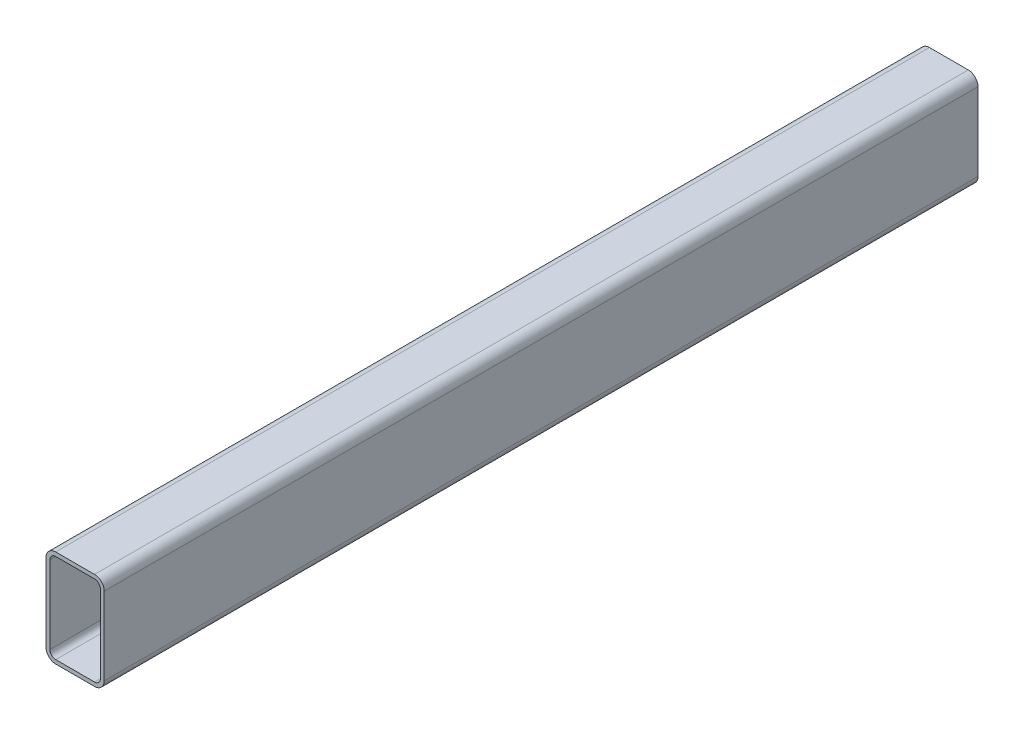
ISO-10303-21;
HEADER;
FILE_DESCRIPTION(('STEP AP214'),'2;1');
FILE_NAME('part.step','',(''),(''),'','','');
FILE_SCHEMA(('AUTOMOTIVE_DESIGN { 1 0 10303 214 1 1 1 1 }'));
ENDSEC;
DATA;
#1=APPLICATION_CONTEXT('core data for automotive mechanical design processes');
#2=APPLICATION_PROTOCOL_DEFINITION('international standard','automotive_design',2000,#1);
#3=PRODUCT_CONTEXT('',#1,'mechanical');
#4=PRODUCT('Part','Part','',(#3));
#5=PRODUCT_RELATED_PRODUCT_CATEGORY('part','',(#4));
#6=PRODUCT_DEFINITION_FORMATION('','',#4);
#7=PRODUCT_DEFINITION_CONTEXT('part definition',#1,'design');
#8=PRODUCT_DEFINITION('design','',#6,#7);
#9=PRODUCT_DEFINITION_SHAPE('','',#8);
#10=(LENGTH_UNIT() NAMED_UNIT(*) SI_UNIT(.MILLI.,.METRE.));
#11=(NAMED_UNIT(*) PLANE_ANGLE_UNIT() SI_UNIT($,.RADIAN.));
#12=(NAMED_UNIT(*) SI_UNIT($,.STERADIAN.) SOLID_ANGLE_UNIT());
#13=UNCERTAINTY_MEASURE_WITH_UNIT(LENGTH_MEASURE(1.E-05),#10,'distance_accuracy_value','');
#14=(GEOMETRIC_REPRESENTATION_CONTEXT(3) GLOBAL_UNCERTAINTY_ASSIGNED_CONTEXT((#13)) GLOBAL_UNIT_ASSIGNED_CONTEXT((#10,
#11,#12)) REPRESENTATION_CONTEXT('',''));
#15=CARTESIAN_POINT('',(0.,0.,0.));
#16=DIRECTION('',(0.,0.,1.));
#17=DIRECTION('',(1.,0.,0.));
#18=AXIS2_PLACEMENT_3D('',#15,#16,#17);
#19=CARTESIAN_POINT('',(-25.,50.,562.5));
#20=DIRECTION('',(0.,0.,-1.));
#21=DIRECTION('',(-1.,0.,0.));
#22=AXIS2_PLACEMENT_3D('',#19,#20,#21);
#23=PLANE('',#22);
#24=DIRECTION('',(0.,-1.,0.));
#25=VECTOR('',#24,1.);
#26=CARTESIAN_POINT('',(-37.5,0.,562.5));
#27=LINE('',#26,#25);
#28=CARTESIAN_POINT('',(-37.5,49.9999999999999,562.5));
#29=VERTEX_POINT('',#28);
#30=CARTESIAN_POINT('',(-37.5,-49.9999999999999,562.5));
#31=VERTEX_POINT('',#30);
#32=EDGE_CURVE('E210',#29,#31,#27,.T.);
#33=ORIENTED_EDGE('',*,*,#32,.T.);
#34=CARTESIAN_POINT('',(-25.,-50.,562.5));
#35=DIRECTION('',(0.,0.,1.));
#36=DIRECTION('',(1.,0.,0.));
#37=AXIS2_PLACEMENT_3D('',#34,#35,#36);
#38=CIRCLE('',#37,12.5);
#39=CARTESIAN_POINT('',(-24.9999999999999,-62.5,562.5));
#40=VERTEX_POINT('',#39);
#41=EDGE_CURVE('E212',#31,#40,#38,.T.);
#42=ORIENTED_EDGE('',*,*,#41,.T.);
#43=DIRECTION('',(1.,0.,0.));
#44=VECTOR('',#43,1.);
#45=CARTESIAN_POINT('',(-24.9999999999999,-62.5,562.5));
#46=LINE('',#45,#44);
#47=CARTESIAN_POINT('',(24.9999999999999,-62.5,562.5));
#48=VERTEX_POINT('',#47);
#49=EDGE_CURVE('E215',#40,#48,#46,.T.);
#50=ORIENTED_EDGE('',*,*,#49,.T.);
#51=CARTESIAN_POINT('',(25.,-50.,562.5));
#52=DIRECTION('',(0.,0.,1.));
#53=DIRECTION('',(-1.,0.,0.));
#54=AXIS2_PLACEMENT_3D('',#51,#52,#53);
#55=CIRCLE('',#54,12.5);
#56=CARTESIAN_POINT('',(37.5,-49.9999999999999,562.5));
#57=VERTEX_POINT('',#56);
#58=EDGE_CURVE('E217',#48,#57,#55,.T.);
#59=ORIENTED_EDGE('',*,*,#58,.T.);
#60=DIRECTION('',(0.,1.,0.));
#61=VECTOR('',#60,1.);
#62=CARTESIAN_POINT('',(37.5,0.,562.5));
#63=LINE('',#62,#61);
#64=CARTESIAN_POINT('',(37.5,49.9999999999999,562.5));
#65=VERTEX_POINT('',#64);
#66=EDGE_CURVE('E219',#57,#65,#63,.T.);
#67=ORIENTED_EDGE('',*,*,#66,.T.);
#68=CARTESIAN_POINT('',(25.,50.,562.5));
#69=DIRECTION('',(0.,0.,1.));
#70=DIRECTION('',(1.,0.,0.));
#71=AXIS2_PLACEMENT_3D('',#68,#69,#70);
#72=CIRCLE('',#71,12.5);
#73=CARTESIAN_POINT('',(24.9999999999999,62.5,562.5));
#74=VERTEX_POINT('',#73);
#75=EDGE_CURVE('E221',#65,#74,#72,.T.);
#76=ORIENTED_EDGE('',*,*,#75,.T.);
#77=DIRECTION('',(-1.,0.,0.));
#78=VECTOR('',#77,1.);
#79=CARTESIAN_POINT('',(-24.9999999999999,62.5,562.5));
#80=LINE('',#79,#78);
#81=CARTESIAN_POINT('',(-24.9999999999999,62.5,562.5));
#82=VERTEX_POINT('',#81);
#83=EDGE_CURVE('E223',#74,#82,#80,.T.);
#84=ORIENTED_EDGE('',*,*,#83,.T.);
#85=CARTESIAN_POINT('',(-25.,50.,562.5));
#86=DIRECTION('',(0.,0.,1.));
#87=DIRECTION('',(-1.,0.,0.));
#88=AXIS2_PLACEMENT_3D('',#85,#86,#87);
#89=CIRCLE('',#88,12.5);
#90=EDGE_CURVE('E225',#82,#29,#89,.T.);
#91=ORIENTED_EDGE('',*,*,#90,.T.);
#92=EDGE_LOOP('',(#33,#42,#50,#59,#67,#76,#84,#91));
#93=FACE_BOUND('',#92,.T.);
#94=CARTESIAN_POINT('',(25.,50.,562.5));
#95=DIRECTION('',(0.,0.,1.));
#96=DIRECTION('',(1.,0.,0.));
#97=AXIS2_PLACEMENT_3D('',#94,#95,#96);
#98=CIRCLE('',#97,7.49999999999999);
#99=CARTESIAN_POINT('',(32.5,49.9999999999999,562.5));
#100=VERTEX_POINT('',#99);
#101=CARTESIAN_POINT('',(25.,57.5,562.5));
#102=VERTEX_POINT('',#101);
#103=EDGE_CURVE('E148',#100,#102,#98,.T.);
#104=ORIENTED_EDGE('',*,*,#103,.F.);
#105=DIRECTION('',(0.,1.,0.));
#106=VECTOR('',#105,1.);
#107=CARTESIAN_POINT('',(32.5,0.,562.5));
#108=LINE('',#107,#106);
#109=CARTESIAN_POINT('',(32.5,-49.9999999999999,562.5));
#110=VERTEX_POINT('',#109);
#111=EDGE_CURVE('E143',#110,#100,#108,.T.);
#112=ORIENTED_EDGE('',*,*,#111,.F.);
#113=CARTESIAN_POINT('',(25.,-50.,562.5));
#114=DIRECTION('',(0.,0.,1.));
#115=DIRECTION('',(-1.,0.,0.));
#116=AXIS2_PLACEMENT_3D('',#113,#114,#115);
#117=CIRCLE('',#116,7.49999999999999);
#118=CARTESIAN_POINT('',(25.,-57.5,562.5));
#119=VERTEX_POINT('',#118);
#120=EDGE_CURVE('E174',#119,#110,#117,.T.);
#121=ORIENTED_EDGE('',*,*,#120,.F.);
#122=DIRECTION('',(1.,0.,0.));
#123=VECTOR('',#122,1.);
#124=CARTESIAN_POINT('',(-25.,-57.5,562.5));
#125=LINE('',#124,#123);
#126=CARTESIAN_POINT('',(-25.,-57.5,562.5));
#127=VERTEX_POINT('',#126);
#128=EDGE_CURVE('E172',#127,#119,#125,.T.);
#129=ORIENTED_EDGE('',*,*,#128,.F.);
#130=CARTESIAN_POINT('',(-25.,-50.,562.5));
#131=DIRECTION('',(0.,0.,1.));
#132=DIRECTION('',(1.,0.,0.));
#133=AXIS2_PLACEMENT_3D('',#130,#131,#132);
#134=CIRCLE('',#133,7.49999999999999);
#135=CARTESIAN_POINT('',(-32.5,-49.9999999999999,562.5));
#136=VERTEX_POINT('',#135);
#137=EDGE_CURVE('E170',#136,#127,#134,.T.);
#138=ORIENTED_EDGE('',*,*,#137,.F.);
#139=DIRECTION('',(0.,-1.,0.));
#140=VECTOR('',#139,1.);
#141=CARTESIAN_POINT('',(-32.5,0.,562.5));
#142=LINE('',#141,#140);
#143=CARTESIAN_POINT('',(-32.5,49.9999999999999,562.5));
#144=VERTEX_POINT('',#143);
#145=EDGE_CURVE('E168',#144,#136,#142,.T.);
#146=ORIENTED_EDGE('',*,*,#145,.F.);
#147=CARTESIAN_POINT('',(-25.,50.,562.5));
#148=DIRECTION('',(0.,0.,1.));
#149=DIRECTION('',(-1.,0.,0.));
#150=AXIS2_PLACEMENT_3D('',#147,#148,#149);
#151=CIRCLE('',#150,7.49999999999999);
#152=CARTESIAN_POINT('',(-25.,57.5,562.5));
#153=VERTEX_POINT('',#152);
#154=EDGE_CURVE('E164',#153,#144,#151,.T.);
#155=ORIENTED_EDGE('',*,*,#154,.F.);
#156=DIRECTION('',(-1.,0.,0.));
#157=VECTOR('',#156,1.);
#158=CARTESIAN_POINT('',(-25.,57.5,562.5));
#159=LINE('',#158,#157);
#160=EDGE_CURVE('E162',#102,#153,#159,.T.);
#161=ORIENTED_EDGE('',*,*,#160,.F.);
#162=EDGE_LOOP('',(#104,#112,#121,#129,#138,#146,#155,#161));
#163=FACE_BOUND('',#162,.T.);
#164=ADVANCED_FACE('F33',(#93,#163),#23,.F.);
#165=CARTESIAN_POINT('',(-25.,50.,-562.5));
#166=DIRECTION('',(0.,0.,-1.));
#167=DIRECTION('',(-1.,0.,0.));
#168=AXIS2_PLACEMENT_3D('',#165,#166,#167);
#169=PLANE('',#168);
#170=DIRECTION('',(0.,-1.,0.));
#171=VECTOR('',#170,1.);
#172=CARTESIAN_POINT('',(-37.5,0.,-562.5));
#173=LINE('',#172,#171);
#174=CARTESIAN_POINT('',(-37.5,49.9999999999999,-562.5));
#175=VERTEX_POINT('',#174);
#176=CARTESIAN_POINT('',(-37.5,-49.9999999999999,-562.5));
#177=VERTEX_POINT('',#176);
#178=EDGE_CURVE('E157',#175,#177,#173,.T.);
#179=ORIENTED_EDGE('',*,*,#178,.F.);
#180=CARTESIAN_POINT('',(-25.,50.,-562.5));
#181=DIRECTION('',(0.,0.,1.));
#182=DIRECTION('',(-1.,0.,0.));
#183=AXIS2_PLACEMENT_3D('',#180,#181,#182);
#184=CIRCLE('',#183,12.5);
#185=CARTESIAN_POINT('',(-24.9999999999999,62.5,-562.5));
#186=VERTEX_POINT('',#185);
#187=EDGE_CURVE('E213',#186,#175,#184,.T.);
#188=ORIENTED_EDGE('',*,*,#187,.F.);
#189=DIRECTION('',(-1.,0.,0.));
#190=VECTOR('',#189,1.);
#191=CARTESIAN_POINT('',(-24.9999999999999,62.5,-562.5));
#192=LINE('',#191,#190);
#193=CARTESIAN_POINT('',(24.9999999999999,62.5,-562.5));
#194=VERTEX_POINT('',#193);
#195=EDGE_CURVE('E241',#194,#186,#192,.T.);
#196=ORIENTED_EDGE('',*,*,#195,.F.);
#197=CARTESIAN_POINT('',(25.,50.,-562.5));
#198=DIRECTION('',(0.,0.,1.));
#199=DIRECTION('',(1.,0.,0.));
#200=AXIS2_PLACEMENT_3D('',#197,#198,#199);
#201=CIRCLE('',#200,12.5);
#202=CARTESIAN_POINT('',(37.5,49.9999999999999,-562.5));
#203=VERTEX_POINT('',#202);
#204=EDGE_CURVE('E239',#203,#194,#201,.T.);
#205=ORIENTED_EDGE('',*,*,#204,.F.);
#206=DIRECTION('',(0.,1.,0.));
#207=VECTOR('',#206,1.);
#208=CARTESIAN_POINT('',(37.5,0.,-562.5));
#209=LINE('',#208,#207);
#210=CARTESIAN_POINT('',(37.5,-49.9999999999999,-562.5));
#211=VERTEX_POINT('',#210);
#212=EDGE_CURVE('E237',#211,#203,#209,.T.);
#213=ORIENTED_EDGE('',*,*,#212,.F.);
#214=CARTESIAN_POINT('',(25.,-50.,-562.5));
#215=DIRECTION('',(0.,0.,1.));
#216=DIRECTION('',(-1.,0.,0.));
#217=AXIS2_PLACEMENT_3D('',#214,#215,#216);
#218=CIRCLE('',#217,12.5);
#219=CARTESIAN_POINT('',(24.9999999999999,-62.5,-562.5));
#220=VERTEX_POINT('',#219);
#221=EDGE_CURVE('E234',#220,#211,#218,.T.);
#222=ORIENTED_EDGE('',*,*,#221,.F.);
#223=DIRECTION('',(1.,0.,0.));
#224=VECTOR('',#223,1.);
#225=CARTESIAN_POINT('',(24.9999999999999,-62.5,-562.5));
#226=LINE('',#225,#224);
#227=CARTESIAN_POINT('',(-24.9999999999999,-62.5,-562.5));
#228=VERTEX_POINT('',#227);
#229=EDGE_CURVE('E232',#228,#220,#226,.T.);
#230=ORIENTED_EDGE('',*,*,#229,.F.);
#231=CARTESIAN_POINT('',(-25.,-50.,-562.5));
#232=DIRECTION('',(0.,0.,1.));
#233=DIRECTION('',(1.,0.,0.));
#234=AXIS2_PLACEMENT_3D('',#231,#232,#233);
#235=CIRCLE('',#234,12.5);
#236=EDGE_CURVE('E229',#177,#228,#235,.T.);
#237=ORIENTED_EDGE('',*,*,#236,.F.);
#238=EDGE_LOOP('',(#179,#188,#196,#205,#213,#222,#230,#237));
#239=FACE_BOUND('',#238,.T.);
#240=DIRECTION('',(0.,1.,0.));
#241=VECTOR('',#240,1.);
#242=CARTESIAN_POINT('',(32.5,0.,-562.5));
#243=LINE('',#242,#241);
#244=CARTESIAN_POINT('',(32.5,-49.9999999999999,-562.5));
#245=VERTEX_POINT('',#244);
#246=CARTESIAN_POINT('',(32.5,49.9999999999999,-562.5));
#247=VERTEX_POINT('',#246);
#248=EDGE_CURVE('E149',#245,#247,#243,.T.);
#249=ORIENTED_EDGE('',*,*,#248,.T.);
#250=CARTESIAN_POINT('',(25.,50.,-562.5));
#251=DIRECTION('',(0.,0.,1.));
#252=DIRECTION('',(1.,0.,0.));
#253=AXIS2_PLACEMENT_3D('',#250,#251,#252);
#254=CIRCLE('',#253,7.49999999999999);
#255=CARTESIAN_POINT('',(25.,57.5,-562.5));
#256=VERTEX_POINT('',#255);
#257=EDGE_CURVE('E155',#247,#256,#254,.T.);
#258=ORIENTED_EDGE('',*,*,#257,.T.);
#259=DIRECTION('',(-1.,0.,0.));
#260=VECTOR('',#259,1.);
#261=CARTESIAN_POINT('',(-25.,57.5,-562.5));
#262=LINE('',#261,#260);
#263=CARTESIAN_POINT('',(-25.,57.5,-562.5));
#264=VERTEX_POINT('',#263);
#265=EDGE_CURVE('E177',#256,#264,#262,.T.);
#266=ORIENTED_EDGE('',*,*,#265,.T.);
#267=CARTESIAN_POINT('',(-25.,50.,-562.5));
#268=DIRECTION('',(0.,0.,1.));
#269=DIRECTION('',(-1.,0.,0.));
#270=AXIS2_PLACEMENT_3D('',#267,#268,#269);
#271=CIRCLE('',#270,7.49999999999999);
#272=CARTESIAN_POINT('',(-32.5,49.9999999999999,-562.5));
#273=VERTEX_POINT('',#272);
#274=EDGE_CURVE('E180',#264,#273,#271,.T.);
#275=ORIENTED_EDGE('',*,*,#274,.T.);
#276=DIRECTION('',(0.,-1.,0.));
#277=VECTOR('',#276,1.);
#278=CARTESIAN_POINT('',(-32.5,0.,-562.5));
#279=LINE('',#278,#277);
#280=CARTESIAN_POINT('',(-32.5,-49.9999999999999,-562.5));
#281=VERTEX_POINT('',#280);
#282=EDGE_CURVE('E183',#273,#281,#279,.T.);
#283=ORIENTED_EDGE('',*,*,#282,.T.);
#284=CARTESIAN_POINT('',(-25.,-50.,-562.5));
#285=DIRECTION('',(0.,0.,1.));
#286=DIRECTION('',(1.,0.,0.));
#287=AXIS2_PLACEMENT_3D('',#284,#285,#286);
#288=CIRCLE('',#287,7.49999999999999);
#289=CARTESIAN_POINT('',(-25.,-57.5,-562.5));
#290=VERTEX_POINT('',#289);
#291=EDGE_CURVE('E186',#281,#290,#288,.T.);
#292=ORIENTED_EDGE('',*,*,#291,.T.);
#293=DIRECTION('',(1.,0.,0.));
#294=VECTOR('',#293,1.);
#295=CARTESIAN_POINT('',(25.,-57.5,-562.5));
#296=LINE('',#295,#294);
#297=CARTESIAN_POINT('',(25.,-57.5,-562.5));
#298=VERTEX_POINT('',#297);
#299=EDGE_CURVE('E189',#290,#298,#296,.T.);
#300=ORIENTED_EDGE('',*,*,#299,.T.);
#301=CARTESIAN_POINT('',(25.,-50.,-562.5));
#302=DIRECTION('',(0.,0.,1.));
#303=DIRECTION('',(-1.,0.,0.));
#304=AXIS2_PLACEMENT_3D('',#301,#302,#303);
#305=CIRCLE('',#304,7.49999999999999);
#306=EDGE_CURVE('E192',#298,#245,#305,.T.);
#307=ORIENTED_EDGE('',*,*,#306,.T.);
#308=EDGE_LOOP('',(#249,#258,#266,#275,#283,#292,#300,#307));
#309=FACE_BOUND('',#308,.T.);
#310=ADVANCED_FACE('F273',(#239,#309),#169,.T.);
#311=CARTESIAN_POINT('',(-37.5,0.,562.5));
#312=DIRECTION('',(1.,0.,0.));
#313=DIRECTION('',(0.,1.,0.));
#314=AXIS2_PLACEMENT_3D('',#311,#312,#313);
#315=PLANE('',#314);
#316=ORIENTED_EDGE('',*,*,#178,.T.);
#317=DIRECTION('',(0.,0.,-1.));
#318=VECTOR('',#317,1.);
#319=CARTESIAN_POINT('',(-37.5,-49.9999999999999,562.5));
#320=LINE('',#319,#318);
#321=EDGE_CURVE('E11',#31,#177,#320,.T.);
#322=ORIENTED_EDGE('',*,*,#321,.F.);
#323=ORIENTED_EDGE('',*,*,#32,.F.);
#324=DIRECTION('',(0.,0.,-1.));
#325=VECTOR('',#324,1.);
#326=CARTESIAN_POINT('',(-37.5,49.9999999999999,562.5));
#327=LINE('',#326,#325);
#328=EDGE_CURVE('E227',#29,#175,#327,.T.);
#329=ORIENTED_EDGE('',*,*,#328,.T.);
#330=EDGE_LOOP('',(#316,#322,#323,#329));
#331=FACE_BOUND('',#330,.T.);
#332=ADVANCED_FACE('F35',(#331),#315,.F.);
#333=CARTESIAN_POINT('',(-25.,-50.,562.5));
#334=DIRECTION('',(0.,0.,-1.));
#335=DIRECTION('',(-1.,0.,0.));
#336=AXIS2_PLACEMENT_3D('',#333,#334,#335);
#337=CYLINDRICAL_SURFACE('',#336,12.5);
#338=ORIENTED_EDGE('',*,*,#236,.T.);
#339=DIRECTION('',(0.,0.,-1.));
#340=VECTOR('',#339,1.);
#341=CARTESIAN_POINT('',(-24.9999999999999,-62.5,562.5));
#342=LINE('',#341,#340);
#343=EDGE_CURVE('E41',#40,#228,#342,.T.);
#344=ORIENTED_EDGE('',*,*,#343,.F.);
#345=ORIENTED_EDGE('',*,*,#41,.F.);
#346=ORIENTED_EDGE('',*,*,#321,.T.);
#347=EDGE_LOOP('',(#338,#344,#345,#346));
#348=FACE_BOUND('',#347,.T.);
#349=ADVANCED_FACE('F269',(#348),#337,.T.);
#350=CARTESIAN_POINT('',(24.9999999999999,-62.5,562.5));
#351=DIRECTION('',(0.,1.,0.));
#352=DIRECTION('',(-1.,0.,0.));
#353=AXIS2_PLACEMENT_3D('',#350,#351,#352);
#354=PLANE('',#353);
#355=ORIENTED_EDGE('',*,*,#229,.T.);
#356=DIRECTION('',(0.,0.,-1.));
#357=VECTOR('',#356,1.);
#358=CARTESIAN_POINT('',(24.9999999999999,-62.5,562.5));
#359=LINE('',#358,#357);
#360=EDGE_CURVE('E259',#48,#220,#359,.T.);
#361=ORIENTED_EDGE('',*,*,#360,.F.);
#362=ORIENTED_EDGE('',*,*,#49,.F.);
#363=ORIENTED_EDGE('',*,*,#343,.T.);
#364=EDGE_LOOP('',(#355,#361,#362,#363));
#365=FACE_BOUND('',#364,.T.);
#366=ADVANCED_FACE('F265',(#365),#354,.F.);
#367=CARTESIAN_POINT('',(25.,-50.,562.5));
#368=DIRECTION('',(0.,0.,-1.));
#369=DIRECTION('',(-1.,0.,0.));
#370=AXIS2_PLACEMENT_3D('',#367,#368,#369);
#371=CYLINDRICAL_SURFACE('',#370,12.5);
#372=ORIENTED_EDGE('',*,*,#221,.T.);
#373=DIRECTION('',(0.,0.,-1.));
#374=VECTOR('',#373,1.);
#375=CARTESIAN_POINT('',(37.5,-49.9999999999999,562.5));
#376=LINE('',#375,#374);
#377=EDGE_CURVE('E256',#57,#211,#376,.T.);
#378=ORIENTED_EDGE('',*,*,#377,.F.);
#379=ORIENTED_EDGE('',*,*,#58,.F.);
#380=ORIENTED_EDGE('',*,*,#360,.T.);
#381=EDGE_LOOP('',(#372,#378,#379,#380));
#382=FACE_BOUND('',#381,.T.);
#383=ADVANCED_FACE('F280',(#382),#371,.T.);
#384=CARTESIAN_POINT('',(37.5,0.,562.5));
#385=DIRECTION('',(-1.,0.,0.));
#386=DIRECTION('',(0.,-1.,0.));
#387=AXIS2_PLACEMENT_3D('',#384,#385,#386);
#388=PLANE('',#387);
#389=ORIENTED_EDGE('',*,*,#212,.T.);
#390=DIRECTION('',(0.,0.,-1.));
#391=VECTOR('',#390,1.);
#392=CARTESIAN_POINT('',(37.5,49.9999999999999,562.5));
#393=LINE('',#392,#391);
#394=EDGE_CURVE('E253',#65,#203,#393,.T.);
#395=ORIENTED_EDGE('',*,*,#394,.F.);
#396=ORIENTED_EDGE('',*,*,#66,.F.);
#397=ORIENTED_EDGE('',*,*,#377,.T.);
#398=EDGE_LOOP('',(#389,#395,#396,#397));
#399=FACE_BOUND('',#398,.T.);
#400=ADVANCED_FACE('F284',(#399),#388,.F.);
#401=CARTESIAN_POINT('',(25.,50.,562.5));
#402=DIRECTION('',(0.,0.,-1.));
#403=DIRECTION('',(-1.,0.,0.));
#404=AXIS2_PLACEMENT_3D('',#401,#402,#403);
#405=CYLINDRICAL_SURFACE('',#404,12.5);
#406=ORIENTED_EDGE('',*,*,#204,.T.);
#407=DIRECTION('',(0.,0.,-1.));
#408=VECTOR('',#407,1.);
#409=CARTESIAN_POINT('',(24.9999999999999,62.5,562.5));
#410=LINE('',#409,#408);
#411=EDGE_CURVE('E250',#74,#194,#410,.T.);
#412=ORIENTED_EDGE('',*,*,#411,.F.);
#413=ORIENTED_EDGE('',*,*,#75,.F.);
#414=ORIENTED_EDGE('',*,*,#394,.T.);
#415=EDGE_LOOP('',(#406,#412,#413,#414));
#416=FACE_BOUND('',#415,.T.);
#417=ADVANCED_FACE('F301',(#416),#405,.T.);
#418=CARTESIAN_POINT('',(-24.9999999999999,62.5,562.5));
#419=DIRECTION('',(0.,-1.,0.));
#420=DIRECTION('',(0.,0.,-1.));
#421=AXIS2_PLACEMENT_3D('',#418,#419,#420);
#422=PLANE('',#421);
#423=ORIENTED_EDGE('',*,*,#195,.T.);
#424=DIRECTION('',(0.,0.,-1.));
#425=VECTOR('',#424,1.);
#426=CARTESIAN_POINT('',(-24.9999999999999,62.5,562.5));
#427=LINE('',#426,#425);
#428=EDGE_CURVE('E247',#82,#186,#427,.T.);
#429=ORIENTED_EDGE('',*,*,#428,.F.);
#430=ORIENTED_EDGE('',*,*,#83,.F.);
#431=ORIENTED_EDGE('',*,*,#411,.T.);
#432=EDGE_LOOP('',(#423,#429,#430,#431));
#433=FACE_BOUND('',#432,.T.);
#434=ADVANCED_FACE('F298',(#433),#422,.F.);
#435=CARTESIAN_POINT('',(-25.,50.,562.5));
#436=DIRECTION('',(0.,0.,-1.));
#437=DIRECTION('',(-1.,0.,0.));
#438=AXIS2_PLACEMENT_3D('',#435,#436,#437);
#439=CYLINDRICAL_SURFACE('',#438,12.5);
#440=ORIENTED_EDGE('',*,*,#187,.T.);
#441=ORIENTED_EDGE('',*,*,#328,.F.);
#442=ORIENTED_EDGE('',*,*,#90,.F.);
#443=ORIENTED_EDGE('',*,*,#428,.T.);
#444=EDGE_LOOP('',(#440,#441,#442,#443));
#445=FACE_BOUND('',#444,.T.);
#446=ADVANCED_FACE('F294',(#445),#439,.T.);
#447=CARTESIAN_POINT('',(25.,50.,562.5));
#448=DIRECTION('',(0.,0.,-1.));
#449=DIRECTION('',(-1.,0.,0.));
#450=AXIS2_PLACEMENT_3D('',#447,#448,#449);
#451=CYLINDRICAL_SURFACE('',#450,7.49999999999999);
#452=ORIENTED_EDGE('',*,*,#257,.F.);
#453=DIRECTION('',(0.,0.,-1.));
#454=VECTOR('',#453,1.);
#455=CARTESIAN_POINT('',(32.5,49.9999999999999,562.5));
#456=LINE('',#455,#454);
#457=EDGE_CURVE('E53',#100,#247,#456,.T.);
#458=ORIENTED_EDGE('',*,*,#457,.F.);
#459=ORIENTED_EDGE('',*,*,#103,.T.);
#460=DIRECTION('',(0.,0.,-1.));
#461=VECTOR('',#460,1.);
#462=CARTESIAN_POINT('',(25.,57.5,562.5));
#463=LINE('',#462,#461);
#464=EDGE_CURVE('E158',#102,#256,#463,.T.);
#465=ORIENTED_EDGE('',*,*,#464,.T.);
#466=EDGE_LOOP('',(#452,#458,#459,#465));
#467=FACE_BOUND('',#466,.T.);
#468=ADVANCED_FACE('F152',(#467),#451,.F.);
#469=CARTESIAN_POINT('',(-25.,57.5,562.5));
#470=DIRECTION('',(0.,-1.,0.));
#471=DIRECTION('',(0.,0.,-1.));
#472=AXIS2_PLACEMENT_3D('',#469,#470,#471);
#473=PLANE('',#472);
#474=ORIENTED_EDGE('',*,*,#265,.F.);
#475=ORIENTED_EDGE('',*,*,#464,.F.);
#476=ORIENTED_EDGE('',*,*,#160,.T.);
#477=DIRECTION('',(0.,0.,-1.));
#478=VECTOR('',#477,1.);
#479=CARTESIAN_POINT('',(-25.,57.5,562.5));
#480=LINE('',#479,#478);
#481=EDGE_CURVE('E207',#153,#264,#480,.T.);
#482=ORIENTED_EDGE('',*,*,#481,.T.);
#483=EDGE_LOOP('',(#474,#475,#476,#482));
#484=FACE_BOUND('',#483,.T.);
#485=ADVANCED_FACE('F323',(#484),#473,.T.);
#486=CARTESIAN_POINT('',(-25.,50.,562.5));
#487=DIRECTION('',(0.,0.,-1.));
#488=DIRECTION('',(-1.,0.,0.));
#489=AXIS2_PLACEMENT_3D('',#486,#487,#488);
#490=CYLINDRICAL_SURFACE('',#489,7.49999999999999);
#491=ORIENTED_EDGE('',*,*,#274,.F.);
#492=ORIENTED_EDGE('',*,*,#481,.F.);
#493=ORIENTED_EDGE('',*,*,#154,.T.);
#494=DIRECTION('',(0.,0.,-1.));
#495=VECTOR('',#494,1.);
#496=CARTESIAN_POINT('',(-32.5,49.9999999999999,562.5));
#497=LINE('',#496,#495);
#498=EDGE_CURVE('E204',#144,#273,#497,.T.);
#499=ORIENTED_EDGE('',*,*,#498,.T.);
#500=EDGE_LOOP('',(#491,#492,#493,#499));
#501=FACE_BOUND('',#500,.T.);
#502=ADVANCED_FACE('F327',(#501),#490,.F.);
#503=CARTESIAN_POINT('',(-32.5,0.,562.5));
#504=DIRECTION('',(1.,0.,0.));
#505=DIRECTION('',(0.,0.,-1.));
#506=AXIS2_PLACEMENT_3D('',#503,#504,#505);
#507=PLANE('',#506);
#508=ORIENTED_EDGE('',*,*,#282,.F.);
#509=ORIENTED_EDGE('',*,*,#498,.F.);
#510=ORIENTED_EDGE('',*,*,#145,.T.);
#511=DIRECTION('',(0.,0.,-1.));
#512=VECTOR('',#511,1.);
#513=CARTESIAN_POINT('',(-32.5,-49.9999999999999,562.5));
#514=LINE('',#513,#512);
#515=EDGE_CURVE('E202',#136,#281,#514,.T.);
#516=ORIENTED_EDGE('',*,*,#515,.T.);
#517=EDGE_LOOP('',(#508,#509,#510,#516));
#518=FACE_BOUND('',#517,.T.);
#519=ADVANCED_FACE('F332',(#518),#507,.T.);
#520=CARTESIAN_POINT('',(-25.,-50.,562.5));
#521=DIRECTION('',(0.,0.,-1.));
#522=DIRECTION('',(-1.,0.,0.));
#523=AXIS2_PLACEMENT_3D('',#520,#521,#522);
#524=CYLINDRICAL_SURFACE('',#523,7.49999999999999);
#525=ORIENTED_EDGE('',*,*,#291,.F.);
#526=ORIENTED_EDGE('',*,*,#515,.F.);
#527=ORIENTED_EDGE('',*,*,#137,.T.);
#528=DIRECTION('',(0.,0.,-1.));
#529=VECTOR('',#528,1.);
#530=CARTESIAN_POINT('',(-25.,-57.5,562.5));
#531=LINE('',#530,#529);
#532=EDGE_CURVE('E199',#127,#290,#531,.T.);
#533=ORIENTED_EDGE('',*,*,#532,.T.);
#534=EDGE_LOOP('',(#525,#526,#527,#533));
#535=FACE_BOUND('',#534,.T.);
#536=ADVANCED_FACE('F339',(#535),#524,.F.);
#537=CARTESIAN_POINT('',(25.,-57.5,562.5));
#538=DIRECTION('',(0.,1.,0.));
#539=DIRECTION('',(0.,0.,1.));
#540=AXIS2_PLACEMENT_3D('',#537,#538,#539);
#541=PLANE('',#540);
#542=ORIENTED_EDGE('',*,*,#299,.F.);
#543=ORIENTED_EDGE('',*,*,#532,.F.);
#544=ORIENTED_EDGE('',*,*,#128,.T.);
#545=DIRECTION('',(0.,0.,-1.));
#546=VECTOR('',#545,1.);
#547=CARTESIAN_POINT('',(25.,-57.5,562.5));
#548=LINE('',#547,#546);
#549=EDGE_CURVE('E197',#119,#298,#548,.T.);
#550=ORIENTED_EDGE('',*,*,#549,.T.);
#551=EDGE_LOOP('',(#542,#543,#544,#550));
#552=FACE_BOUND('',#551,.T.);
#553=ADVANCED_FACE('F343',(#552),#541,.T.);
#554=CARTESIAN_POINT('',(25.,-50.,562.5));
#555=DIRECTION('',(0.,0.,-1.));
#556=DIRECTION('',(-1.,0.,0.));
#557=AXIS2_PLACEMENT_3D('',#554,#555,#556);
#558=CYLINDRICAL_SURFACE('',#557,7.49999999999999);
#559=ORIENTED_EDGE('',*,*,#306,.F.);
#560=ORIENTED_EDGE('',*,*,#549,.F.);
#561=ORIENTED_EDGE('',*,*,#120,.T.);
#562=DIRECTION('',(0.,0.,-1.));
#563=VECTOR('',#562,1.);
#564=CARTESIAN_POINT('',(32.5,-49.9999999999999,562.5));
#565=LINE('',#564,#563);
#566=EDGE_CURVE('E48',#110,#245,#565,.T.);
#567=ORIENTED_EDGE('',*,*,#566,.T.);
#568=EDGE_LOOP('',(#559,#560,#561,#567));
#569=FACE_BOUND('',#568,.T.);
#570=ADVANCED_FACE('F347',(#569),#558,.F.);
#571=CARTESIAN_POINT('',(32.5,0.,562.5));
#572=DIRECTION('',(-1.,0.,0.));
#573=DIRECTION('',(0.,0.,1.));
#574=AXIS2_PLACEMENT_3D('',#571,#572,#573);
#575=PLANE('',#574);
#576=ORIENTED_EDGE('',*,*,#248,.F.);
#577=ORIENTED_EDGE('',*,*,#566,.F.);
#578=ORIENTED_EDGE('',*,*,#111,.T.);
#579=ORIENTED_EDGE('',*,*,#457,.T.);
#580=EDGE_LOOP('',(#576,#577,#578,#579));
#581=FACE_BOUND('',#580,.T.);
#582=ADVANCED_FACE('F144',(#581),#575,.T.);
#583=CLOSED_SHELL('',(#164,#310,#332,#349,#366,#383,#400,#417,#434,#446,#468,#485,#502,#519,
#536,#553,#570,#582));
#584=MANIFOLD_SOLID_BREP('B2',#583);
#585=ADVANCED_BREP_SHAPE_REPRESENTATION('',(#18,#584),#14);
#586=SHAPE_DEFINITION_REPRESENTATION(#9,#585);
ENDSEC;
END-ISO-10303-21;
